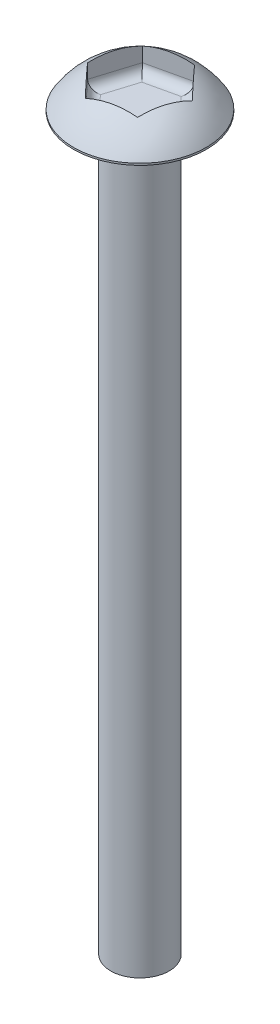
ISO-10303-21;
HEADER;
FILE_DESCRIPTION(('STEP AP214'),'2;1');
FILE_NAME('part.step','',(''),(''),'','','');
FILE_SCHEMA(('AUTOMOTIVE_DESIGN { 1 0 10303 214 1 1 1 1 }'));
ENDSEC;
DATA;
#1=APPLICATION_CONTEXT('core data for automotive mechanical design processes');
#2=APPLICATION_PROTOCOL_DEFINITION('international standard','automotive_design',2000,#1);
#3=PRODUCT_CONTEXT('',#1,'mechanical');
#4=PRODUCT('Part','Part','',(#3));
#5=PRODUCT_RELATED_PRODUCT_CATEGORY('part','',(#4));
#6=PRODUCT_DEFINITION_FORMATION('','',#4);
#7=PRODUCT_DEFINITION_CONTEXT('part definition',#1,'design');
#8=PRODUCT_DEFINITION('design','',#6,#7);
#9=PRODUCT_DEFINITION_SHAPE('','',#8);
#10=(LENGTH_UNIT() NAMED_UNIT(*) SI_UNIT(.MILLI.,.METRE.));
#11=(NAMED_UNIT(*) PLANE_ANGLE_UNIT() SI_UNIT($,.RADIAN.));
#12=(NAMED_UNIT(*) SI_UNIT($,.STERADIAN.) SOLID_ANGLE_UNIT());
#13=UNCERTAINTY_MEASURE_WITH_UNIT(LENGTH_MEASURE(1.E-05),#10,'distance_accuracy_value','');
#14=(GEOMETRIC_REPRESENTATION_CONTEXT(3) GLOBAL_UNCERTAINTY_ASSIGNED_CONTEXT((#13)) GLOBAL_UNIT_ASSIGNED_CONTEXT((#10,
#11,#12)) REPRESENTATION_CONTEXT('',''));
#15=CARTESIAN_POINT('',(0.,0.,0.));
#16=DIRECTION('',(0.,0.,1.));
#17=DIRECTION('',(1.,0.,0.));
#18=AXIS2_PLACEMENT_3D('',#15,#16,#17);
#19=CARTESIAN_POINT('',(0.,94.6495645899507,0.));
#20=DIRECTION('',(0.,0.,1.));
#21=DIRECTION('',(1.,0.,0.));
#22=AXIS2_PLACEMENT_3D('',#19,#20,#21);
#23=SPHERICAL_SURFACE('',#22,10.6844354100493);
#24=CARTESIAN_POINT('',(0.,100.254,0.));
#25=DIRECTION('',(0.,1.,0.));
#26=DIRECTION('',(0.,0.,1.));
#27=AXIS2_PLACEMENT_3D('',#24,#25,#26);
#28=CIRCLE('',#27,9.09656329423925);
#29=CARTESIAN_POINT('',(0.,100.254,9.09656329423925));
#30=VERTEX_POINT('',#29);
#31=EDGE_CURVE('E207',#30,#30,#28,.T.);
#32=ORIENTED_EDGE('',*,*,#31,.T.);
#33=EDGE_LOOP('',(#32));
#34=FACE_BOUND('',#33,.T.);
#35=CARTESIAN_POINT('',(-3.80527173605453,94.6495645899507,3.5235150143176));
#36=DIRECTION('',(0.733749594397492,0.,-0.679419997292923));
#37=DIRECTION('',(-0.679419997292924,0.,-0.733749594397492));
#38=AXIS2_PLACEMENT_3D('',#35,#36,#37);
#39=CIRCLE('',#38,9.34140829801257);
#40=CARTESIAN_POINT('',(-1.77096939404458,103.498113923583,5.72048967546836));
#41=VERTEX_POINT('',#40);
#42=CARTESIAN_POINT('',(-5.83957407806449,103.498113923583,1.32654035316684));
#43=VERTEX_POINT('',#42);
#44=EDGE_CURVE('E129',#41,#43,#39,.F.);
#45=ORIENTED_EDGE('',*,*,#44,.T.);
#46=CARTESIAN_POINT('',(-4.9540893810422,94.6495645899507,-1.53370448456734));
#47=DIRECTION('',(0.955269774693572,0.,0.295735790118294));
#48=DIRECTION('',(0.295735790118294,0.,-0.955269774693572));
#49=AXIS2_PLACEMENT_3D('',#46,#47,#48);
#50=CIRCLE('',#49,9.34140829801257);
#51=CARTESIAN_POINT('',(-4.06860468401991,103.498113923583,-4.39394932230152));
#52=VERTEX_POINT('',#51);
#53=EDGE_CURVE('E124',#43,#52,#50,.F.);
#54=ORIENTED_EDGE('',*,*,#53,.T.);
#55=CARTESIAN_POINT('',(-1.14881764498766,94.6495645899507,-5.05721949888494));
#56=DIRECTION('',(0.22152018029608,0.,0.975155787411218));
#57=DIRECTION('',(0.975155787411218,0.,-0.22152018029608));
#58=AXIS2_PLACEMENT_3D('',#55,#56,#57);
#59=CIRCLE('',#58,9.34140829801257);
#60=CARTESIAN_POINT('',(1.77096939404458,103.498113923583,-5.72048967546836));
#61=VERTEX_POINT('',#60);
#62=EDGE_CURVE('E107',#52,#61,#59,.F.);
#63=ORIENTED_EDGE('',*,*,#62,.T.);
#64=CARTESIAN_POINT('',(3.80527173605454,94.6495645899507,-3.5235150143176));
#65=DIRECTION('',(-0.733749594397492,0.,0.679419997292924));
#66=DIRECTION('',(0.679419997292924,0.,0.733749594397492));
#67=AXIS2_PLACEMENT_3D('',#64,#65,#66);
#68=CIRCLE('',#67,9.34140829801257);
#69=CARTESIAN_POINT('',(5.83957407806449,103.498113923583,-1.32654035316684));
#70=VERTEX_POINT('',#69);
#71=EDGE_CURVE('E119',#61,#70,#68,.F.);
#72=ORIENTED_EDGE('',*,*,#71,.T.);
#73=CARTESIAN_POINT('',(4.9540893810422,94.6495645899507,1.53370448456734));
#74=DIRECTION('',(-0.955269774693572,0.,-0.295735790118294));
#75=DIRECTION('',(-0.295735790118294,0.,0.955269774693572));
#76=AXIS2_PLACEMENT_3D('',#73,#74,#75);
#77=CIRCLE('',#76,9.34140829801257);
#78=CARTESIAN_POINT('',(4.06860468401991,103.498113923583,4.39394932230153));
#79=VERTEX_POINT('',#78);
#80=EDGE_CURVE('E216',#70,#79,#77,.F.);
#81=ORIENTED_EDGE('',*,*,#80,.T.);
#82=CARTESIAN_POINT('',(1.14881764498766,94.6495645899507,5.05721949888494));
#83=DIRECTION('',(-0.22152018029608,0.,-0.975155787411218));
#84=DIRECTION('',(-0.975155787411218,0.,0.22152018029608));
#85=AXIS2_PLACEMENT_3D('',#82,#83,#84);
#86=CIRCLE('',#85,9.34140829801257);
#87=EDGE_CURVE('E134',#79,#41,#86,.F.);
#88=ORIENTED_EDGE('',*,*,#87,.T.);
#89=EDGE_LOOP('',(#45,#54,#63,#72,#81,#88));
#90=FACE_BOUND('',#89,.T.);
#91=ADVANCED_FACE('F33',(#34,#90),#23,.T.);
#92=CARTESIAN_POINT('',(0.,100.,0.));
#93=DIRECTION('',(0.,-1.,0.));
#94=DIRECTION('',(0.,0.,-1.));
#95=AXIS2_PLACEMENT_3D('',#92,#93,#94);
#96=CYLINDRICAL_SURFACE('',#95,4.);
#97=CARTESIAN_POINT('',(0.,100.,0.));
#98=DIRECTION('',(0.,1.,0.));
#99=DIRECTION('',(0.,0.,1.));
#100=AXIS2_PLACEMENT_3D('',#97,#98,#99);
#101=CIRCLE('',#100,4.);
#102=CARTESIAN_POINT('',(0.,100.,4.));
#103=VERTEX_POINT('',#102);
#104=EDGE_CURVE('E120',#103,#103,#101,.T.);
#105=ORIENTED_EDGE('',*,*,#104,.F.);
#106=EDGE_LOOP('',(#105));
#107=FACE_BOUND('',#106,.T.);
#108=CARTESIAN_POINT('',(0.,0.,0.));
#109=DIRECTION('',(0.,1.,0.));
#110=DIRECTION('',(0.,0.,1.));
#111=AXIS2_PLACEMENT_3D('',#108,#109,#110);
#112=CIRCLE('',#111,4.);
#113=CARTESIAN_POINT('',(0.,0.,4.));
#114=VERTEX_POINT('',#113);
#115=EDGE_CURVE('E210',#114,#114,#112,.T.);
#116=ORIENTED_EDGE('',*,*,#115,.T.);
#117=EDGE_LOOP('',(#116));
#118=FACE_BOUND('',#117,.T.);
#119=ADVANCED_FACE('F232',(#107,#118),#96,.T.);
#120=CARTESIAN_POINT('',(0.,0.,0.));
#121=DIRECTION('',(0.,1.,0.));
#122=DIRECTION('',(0.,0.,1.));
#123=AXIS2_PLACEMENT_3D('',#120,#121,#122);
#124=PLANE('',#123);
#125=ORIENTED_EDGE('',*,*,#115,.F.);
#126=EDGE_LOOP('',(#125));
#127=FACE_BOUND('',#126,.T.);
#128=ADVANCED_FACE('F238',(#127),#124,.F.);
#129=CARTESIAN_POINT('',(0.,100.,0.));
#130=DIRECTION('',(0.,1.,0.));
#131=DIRECTION('',(0.,0.,1.));
#132=AXIS2_PLACEMENT_3D('',#129,#130,#131);
#133=PLANE('',#132);
#134=CARTESIAN_POINT('',(0.,100.,0.));
#135=DIRECTION('',(0.,1.,0.));
#136=DIRECTION('',(0.,0.,1.));
#137=AXIS2_PLACEMENT_3D('',#134,#135,#136);
#138=CIRCLE('',#137,9.09656329423925);
#139=CARTESIAN_POINT('',(0.,100.,9.09656329423925));
#140=VERTEX_POINT('',#139);
#141=EDGE_CURVE('E204',#140,#140,#138,.T.);
#142=ORIENTED_EDGE('',*,*,#141,.F.);
#143=EDGE_LOOP('',(#142));
#144=FACE_BOUND('',#143,.T.);
#145=ORIENTED_EDGE('',*,*,#104,.T.);
#146=EDGE_LOOP('',(#145));
#147=FACE_BOUND('',#146,.T.);
#148=ADVANCED_FACE('F313',(#144,#147),#133,.F.);
#149=CARTESIAN_POINT('',(0.,100.254,0.));
#150=DIRECTION('',(0.,-1.,0.));
#151=DIRECTION('',(0.,0.,-1.));
#152=AXIS2_PLACEMENT_3D('',#149,#150,#151);
#153=CYLINDRICAL_SURFACE('',#152,9.09656329423925);
#154=ORIENTED_EDGE('',*,*,#31,.F.);
#155=EDGE_LOOP('',(#154));
#156=FACE_BOUND('',#155,.T.);
#157=ORIENTED_EDGE('',*,*,#141,.T.);
#158=EDGE_LOOP('',(#157));
#159=FACE_BOUND('',#158,.T.);
#160=ADVANCED_FACE('F299',(#156,#159),#153,.T.);
#161=CARTESIAN_POINT('',(-4.06860468401991,105.334,-4.39394932230152));
#162=DIRECTION('',(0.955269774693572,0.,0.295735790118294));
#163=DIRECTION('',(0.295735790118294,0.,-0.955269774693572));
#164=AXIS2_PLACEMENT_3D('',#161,#162,#163);
#165=PLANE('',#164);
#166=DIRECTION('',(0.,-1.,0.));
#167=VECTOR('',#166,1.);
#168=CARTESIAN_POINT('',(-5.83957407806449,105.334,1.32654035316684));
#169=LINE('',#168,#167);
#170=CARTESIAN_POINT('',(-5.83957407806449,101.524,1.32654035316684));
#171=VERTEX_POINT('',#170);
#172=EDGE_CURVE('E202',#43,#171,#169,.T.);
#173=ORIENTED_EDGE('',*,*,#172,.T.);
#174=DIRECTION('',(-0.295735790118294,0.,0.955269774693572));
#175=VECTOR('',#174,1.);
#176=CARTESIAN_POINT('',(-4.06860468401991,101.524,-4.39394932230152));
#177=LINE('',#176,#175);
#178=CARTESIAN_POINT('',(-4.06860468401991,101.524,-4.39394932230152));
#179=VERTEX_POINT('',#178);
#180=EDGE_CURVE('E11',#171,#179,#177,.F.);
#181=ORIENTED_EDGE('',*,*,#180,.T.);
#182=DIRECTION('',(0.,-1.,0.));
#183=VECTOR('',#182,1.);
#184=CARTESIAN_POINT('',(-4.06860468401991,105.334,-4.39394932230152));
#185=LINE('',#184,#183);
#186=EDGE_CURVE('E111',#52,#179,#185,.T.);
#187=ORIENTED_EDGE('',*,*,#186,.F.);
#188=ORIENTED_EDGE('',*,*,#53,.F.);
#189=EDGE_LOOP('',(#173,#181,#187,#188));
#190=FACE_BOUND('',#189,.T.);
#191=ADVANCED_FACE('F123',(#190),#165,.T.);
#192=CARTESIAN_POINT('',(-5.83957407806449,105.334,1.32654035316684));
#193=DIRECTION('',(0.733749594397492,0.,-0.679419997292923));
#194=DIRECTION('',(-0.679419997292924,0.,-0.733749594397492));
#195=AXIS2_PLACEMENT_3D('',#192,#193,#194);
#196=PLANE('',#195);
#197=DIRECTION('',(0.,-1.,0.));
#198=VECTOR('',#197,1.);
#199=CARTESIAN_POINT('',(-1.77096939404458,105.334,5.72048967546836));
#200=LINE('',#199,#198);
#201=CARTESIAN_POINT('',(-1.77096939404458,101.524,5.72048967546836));
#202=VERTEX_POINT('',#201);
#203=EDGE_CURVE('E200',#41,#202,#200,.T.);
#204=ORIENTED_EDGE('',*,*,#203,.T.);
#205=DIRECTION('',(0.679419997292924,0.,0.733749594397492));
#206=VECTOR('',#205,1.);
#207=CARTESIAN_POINT('',(-5.83957407806449,101.524,1.32654035316684));
#208=LINE('',#207,#206);
#209=EDGE_CURVE('E42',#202,#171,#208,.F.);
#210=ORIENTED_EDGE('',*,*,#209,.T.);
#211=ORIENTED_EDGE('',*,*,#172,.F.);
#212=ORIENTED_EDGE('',*,*,#44,.F.);
#213=EDGE_LOOP('',(#204,#210,#211,#212));
#214=FACE_BOUND('',#213,.T.);
#215=ADVANCED_FACE('F229',(#214),#196,.T.);
#216=CARTESIAN_POINT('',(-1.77096939404458,105.334,5.72048967546836));
#217=DIRECTION('',(-0.22152018029608,0.,-0.975155787411218));
#218=DIRECTION('',(-0.975155787411218,0.,0.22152018029608));
#219=AXIS2_PLACEMENT_3D('',#216,#217,#218);
#220=PLANE('',#219);
#221=DIRECTION('',(0.,-1.,0.));
#222=VECTOR('',#221,1.);
#223=CARTESIAN_POINT('',(4.06860468401991,105.334,4.39394932230153));
#224=LINE('',#223,#222);
#225=CARTESIAN_POINT('',(4.06860468401991,101.524,4.39394932230153));
#226=VERTEX_POINT('',#225);
#227=EDGE_CURVE('E196',#79,#226,#224,.T.);
#228=ORIENTED_EDGE('',*,*,#227,.T.);
#229=DIRECTION('',(0.975155787411218,0.,-0.22152018029608));
#230=VECTOR('',#229,1.);
#231=CARTESIAN_POINT('',(-1.77096939404458,101.524,5.72048967546836));
#232=LINE('',#231,#230);
#233=EDGE_CURVE('E57',#226,#202,#232,.F.);
#234=ORIENTED_EDGE('',*,*,#233,.T.);
#235=ORIENTED_EDGE('',*,*,#203,.F.);
#236=ORIENTED_EDGE('',*,*,#87,.F.);
#237=EDGE_LOOP('',(#228,#234,#235,#236));
#238=FACE_BOUND('',#237,.T.);
#239=ADVANCED_FACE('F219',(#238),#220,.T.);
#240=CARTESIAN_POINT('',(4.06860468401991,105.334,4.39394932230153));
#241=DIRECTION('',(-0.955269774693572,0.,-0.295735790118294));
#242=DIRECTION('',(-0.295735790118294,0.,0.955269774693572));
#243=AXIS2_PLACEMENT_3D('',#240,#241,#242);
#244=PLANE('',#243);
#245=DIRECTION('',(0.,-1.,0.));
#246=VECTOR('',#245,1.);
#247=CARTESIAN_POINT('',(5.83957407806449,105.334,-1.32654035316684));
#248=LINE('',#247,#246);
#249=CARTESIAN_POINT('',(5.83957407806449,101.524,-1.32654035316684));
#250=VERTEX_POINT('',#249);
#251=EDGE_CURVE('E194',#70,#250,#248,.T.);
#252=ORIENTED_EDGE('',*,*,#251,.T.);
#253=DIRECTION('',(0.295735790118294,0.,-0.955269774693572));
#254=VECTOR('',#253,1.);
#255=CARTESIAN_POINT('',(4.06860468401991,101.524,4.39394932230153));
#256=LINE('',#255,#254);
#257=EDGE_CURVE('E152',#250,#226,#256,.F.);
#258=ORIENTED_EDGE('',*,*,#257,.T.);
#259=ORIENTED_EDGE('',*,*,#227,.F.);
#260=ORIENTED_EDGE('',*,*,#80,.F.);
#261=EDGE_LOOP('',(#252,#258,#259,#260));
#262=FACE_BOUND('',#261,.T.);
#263=ADVANCED_FACE('F221',(#262),#244,.T.);
#264=CARTESIAN_POINT('',(5.83957407806449,105.334,-1.32654035316684));
#265=DIRECTION('',(-0.733749594397492,0.,0.679419997292924));
#266=DIRECTION('',(0.679419997292924,0.,0.733749594397492));
#267=AXIS2_PLACEMENT_3D('',#264,#265,#266);
#268=PLANE('',#267);
#269=DIRECTION('',(0.,-1.,0.));
#270=VECTOR('',#269,1.);
#271=CARTESIAN_POINT('',(1.77096939404458,105.334,-5.72048967546836));
#272=LINE('',#271,#270);
#273=CARTESIAN_POINT('',(1.77096939404458,101.524,-5.72048967546836));
#274=VERTEX_POINT('',#273);
#275=EDGE_CURVE('E114',#61,#274,#272,.T.);
#276=ORIENTED_EDGE('',*,*,#275,.T.);
#277=DIRECTION('',(-0.679419997292924,0.,-0.733749594397492));
#278=VECTOR('',#277,1.);
#279=CARTESIAN_POINT('',(5.83957407806449,101.524,-1.32654035316684));
#280=LINE('',#279,#278);
#281=EDGE_CURVE('E150',#274,#250,#280,.F.);
#282=ORIENTED_EDGE('',*,*,#281,.T.);
#283=ORIENTED_EDGE('',*,*,#251,.F.);
#284=ORIENTED_EDGE('',*,*,#71,.F.);
#285=EDGE_LOOP('',(#276,#282,#283,#284));
#286=FACE_BOUND('',#285,.T.);
#287=ADVANCED_FACE('F191',(#286),#268,.T.);
#288=CARTESIAN_POINT('',(1.77096939404458,105.334,-5.72048967546836));
#289=DIRECTION('',(0.22152018029608,0.,0.975155787411218));
#290=DIRECTION('',(0.975155787411218,0.,-0.22152018029608));
#291=AXIS2_PLACEMENT_3D('',#288,#289,#290);
#292=PLANE('',#291);
#293=ORIENTED_EDGE('',*,*,#186,.T.);
#294=DIRECTION('',(-0.975155787411218,0.,0.22152018029608));
#295=VECTOR('',#294,1.);
#296=CARTESIAN_POINT('',(1.77096939404458,101.524,-5.72048967546836));
#297=LINE('',#296,#295);
#298=EDGE_CURVE('E148',#179,#274,#297,.F.);
#299=ORIENTED_EDGE('',*,*,#298,.T.);
#300=ORIENTED_EDGE('',*,*,#275,.F.);
#301=ORIENTED_EDGE('',*,*,#62,.F.);
#302=EDGE_LOOP('',(#293,#299,#300,#301));
#303=FACE_BOUND('',#302,.T.);
#304=ADVANCED_FACE('F109',(#303),#292,.T.);
#305=CARTESIAN_POINT('',(0.,100.254,0.));
#306=DIRECTION('',(0.,1.,0.));
#307=DIRECTION('',(0.,0.,1.));
#308=AXIS2_PLACEMENT_3D('',#305,#306,#307);
#309=PLANE('',#308);
#310=DIRECTION('',(-0.679419997292924,0.,-0.733749594397492));
#311=VECTOR('',#310,1.);
#312=CARTESIAN_POINT('',(0.839107409159768,100.254,-4.85762627890635));
#313=LINE('',#312,#311);
#314=CARTESIAN_POINT('',(4.40953767890072,100.254,-1.00168772442565));
#315=VERTEX_POINT('',#314);
#316=CARTESIAN_POINT('',(1.33728182343872,100.254,-4.31961551108552));
#317=VERTEX_POINT('',#316);
#318=EDGE_CURVE('E143',#315,#317,#313,.T.);
#319=ORIENTED_EDGE('',*,*,#318,.T.);
#320=DIRECTION('',(-0.975155787411218,0.,0.22152018029608));
#321=VECTOR('',#320,1.);
#322=CARTESIAN_POINT('',(-3.78727405504388,100.254,-3.15550147228928));
#323=LINE('',#322,#321);
#324=CARTESIAN_POINT('',(-3.072255855462,100.254,-3.31792778665987));
#325=VERTEX_POINT('',#324);
#326=EDGE_CURVE('E145',#317,#325,#323,.T.);
#327=ORIENTED_EDGE('',*,*,#326,.T.);
#328=DIRECTION('',(-0.295735790118294,0.,0.955269774693572));
#329=VECTOR('',#328,1.);
#330=CARTESIAN_POINT('',(-4.62638146420365,100.254,1.70212480661707));
#331=LINE('',#330,#329);
#332=CARTESIAN_POINT('',(-4.40953767890072,100.254,1.00168772442565));
#333=VERTEX_POINT('',#332);
#334=EDGE_CURVE('E130',#325,#333,#331,.T.);
#335=ORIENTED_EDGE('',*,*,#334,.T.);
#336=DIRECTION('',(0.679419997292924,0.,0.733749594397492));
#337=VECTOR('',#336,1.);
#338=CARTESIAN_POINT('',(-0.839107409159763,100.254,4.85762627890635));
#339=LINE('',#338,#337);
#340=CARTESIAN_POINT('',(-1.33728182343872,100.254,4.31961551108552));
#341=VERTEX_POINT('',#340);
#342=EDGE_CURVE('E132',#333,#341,#339,.T.);
#343=ORIENTED_EDGE('',*,*,#342,.T.);
#344=DIRECTION('',(0.975155787411218,0.,-0.22152018029608));
#345=VECTOR('',#344,1.);
#346=CARTESIAN_POINT('',(3.78727405504388,100.254,3.15550147228928));
#347=LINE('',#346,#345);
#348=CARTESIAN_POINT('',(3.072255855462,100.254,3.31792778665987));
#349=VERTEX_POINT('',#348);
#350=EDGE_CURVE('E139',#341,#349,#347,.T.);
#351=ORIENTED_EDGE('',*,*,#350,.T.);
#352=DIRECTION('',(0.295735790118294,0.,-0.955269774693572));
#353=VECTOR('',#352,1.);
#354=CARTESIAN_POINT('',(4.62638146420365,100.254,-1.70212480661707));
#355=LINE('',#354,#353);
#356=EDGE_CURVE('E141',#349,#315,#355,.T.);
#357=ORIENTED_EDGE('',*,*,#356,.T.);
#358=EDGE_LOOP('',(#319,#327,#335,#343,#351,#357));
#359=FACE_BOUND('',#358,.T.);
#360=ADVANCED_FACE('F256',(#359),#309,.T.);
#361=CARTESIAN_POINT('',(0.86748701601164,101.524,3.8187716488727));
#362=DIRECTION('',(-0.975155787411218,0.,0.22152018029608));
#363=DIRECTION('',(0.22152018029608,0.,0.975155787411218));
#364=AXIS2_PLACEMENT_3D('',#361,#362,#363);
#365=CYLINDRICAL_SURFACE('',#364,1.27);
#366=CARTESIAN_POINT('',(-1.33728182343872,101.524,4.31961551108552));
#367=DIRECTION('',(-0.955269774693572,0.,-0.295735790118294));
#368=DIRECTION('',(-0.295735790118294,0.,0.955269774693572));
#369=AXIS2_PLACEMENT_3D('',#366,#367,#368);
#370=ELLIPSE('',#369,1.46646968374165,1.27);
#371=EDGE_CURVE('E165',#202,#341,#370,.F.);
#372=ORIENTED_EDGE('',*,*,#371,.F.);
#373=ORIENTED_EDGE('',*,*,#233,.F.);
#374=CARTESIAN_POINT('',(3.072255855462,101.524,3.31792778665987));
#375=DIRECTION('',(-0.733749594397492,0.,0.679419997292923));
#376=DIRECTION('',(0.679419997292923,0.,0.733749594397492));
#377=AXIS2_PLACEMENT_3D('',#374,#375,#376);
#378=ELLIPSE('',#377,1.46646968374165,1.27);
#379=EDGE_CURVE('E37',#349,#226,#378,.T.);
#380=ORIENTED_EDGE('',*,*,#379,.F.);
#381=ORIENTED_EDGE('',*,*,#350,.F.);
#382=EDGE_LOOP('',(#372,#373,#380,#381));
#383=FACE_BOUND('',#382,.T.);
#384=ADVANCED_FACE('F35',(#383),#365,.F.);
#385=CARTESIAN_POINT('',(3.74089676718136,101.524,1.15812003111711));
#386=DIRECTION('',(-0.295735790118294,0.,0.955269774693572));
#387=DIRECTION('',(0.955269774693572,0.,0.295735790118294));
#388=AXIS2_PLACEMENT_3D('',#385,#386,#387);
#389=CYLINDRICAL_SURFACE('',#388,1.27);
#390=ORIENTED_EDGE('',*,*,#379,.T.);
#391=ORIENTED_EDGE('',*,*,#257,.F.);
#392=CARTESIAN_POINT('',(4.40953767890072,101.524,-1.00168772442565));
#393=DIRECTION('',(0.22152018029608,0.,0.975155787411218));
#394=DIRECTION('',(0.975155787411218,0.,-0.22152018029608));
#395=AXIS2_PLACEMENT_3D('',#392,#393,#394);
#396=ELLIPSE('',#395,1.46646968374165,1.27);
#397=EDGE_CURVE('E163',#315,#250,#396,.T.);
#398=ORIENTED_EDGE('',*,*,#397,.F.);
#399=ORIENTED_EDGE('',*,*,#356,.F.);
#400=EDGE_LOOP('',(#390,#391,#398,#399));
#401=FACE_BOUND('',#400,.T.);
#402=ADVANCED_FACE('F175',(#401),#389,.F.);
#403=CARTESIAN_POINT('',(-2.87340975116972,101.524,2.66065161775558));
#404=DIRECTION('',(-0.679419997292924,0.,-0.733749594397492));
#405=DIRECTION('',(-0.733749594397492,0.,0.679419997292924));
#406=AXIS2_PLACEMENT_3D('',#403,#404,#405);
#407=CYLINDRICAL_SURFACE('',#406,1.27);
#408=ORIENTED_EDGE('',*,*,#371,.T.);
#409=ORIENTED_EDGE('',*,*,#342,.F.);
#410=CARTESIAN_POINT('',(-4.40953767890072,101.524,1.00168772442565));
#411=DIRECTION('',(-0.22152018029608,0.,-0.975155787411218));
#412=DIRECTION('',(-0.975155787411218,0.,0.221520180296081));
#413=AXIS2_PLACEMENT_3D('',#410,#411,#412);
#414=ELLIPSE('',#413,1.46646968374165,1.27);
#415=EDGE_CURVE('E160',#171,#333,#414,.F.);
#416=ORIENTED_EDGE('',*,*,#415,.F.);
#417=ORIENTED_EDGE('',*,*,#209,.F.);
#418=EDGE_LOOP('',(#408,#409,#416,#417));
#419=FACE_BOUND('',#418,.T.);
#420=ADVANCED_FACE('F180',(#419),#407,.F.);
#421=CARTESIAN_POINT('',(2.87340975116972,101.524,-2.66065161775559));
#422=DIRECTION('',(0.679419997292924,0.,0.733749594397492));
#423=DIRECTION('',(0.733749594397492,0.,-0.679419997292924));
#424=AXIS2_PLACEMENT_3D('',#421,#422,#423);
#425=CYLINDRICAL_SURFACE('',#424,1.27);
#426=ORIENTED_EDGE('',*,*,#397,.T.);
#427=ORIENTED_EDGE('',*,*,#281,.F.);
#428=CARTESIAN_POINT('',(1.33728182343872,101.524,-4.31961551108552));
#429=DIRECTION('',(0.955269774693572,0.,0.295735790118294));
#430=DIRECTION('',(0.295735790118294,0.,-0.955269774693572));
#431=AXIS2_PLACEMENT_3D('',#428,#429,#430);
#432=ELLIPSE('',#431,1.46646968374165,1.27);
#433=EDGE_CURVE('E158',#317,#274,#432,.T.);
#434=ORIENTED_EDGE('',*,*,#433,.F.);
#435=ORIENTED_EDGE('',*,*,#318,.F.);
#436=EDGE_LOOP('',(#426,#427,#434,#435));
#437=FACE_BOUND('',#436,.T.);
#438=ADVANCED_FACE('F247',(#437),#425,.F.);
#439=CARTESIAN_POINT('',(-3.74089676718136,101.524,-1.15812003111711));
#440=DIRECTION('',(0.295735790118294,0.,-0.955269774693572));
#441=DIRECTION('',(-0.955269774693572,0.,-0.295735790118294));
#442=AXIS2_PLACEMENT_3D('',#439,#440,#441);
#443=CYLINDRICAL_SURFACE('',#442,1.27);
#444=ORIENTED_EDGE('',*,*,#415,.T.);
#445=ORIENTED_EDGE('',*,*,#334,.F.);
#446=CARTESIAN_POINT('',(-3.072255855462,101.524,-3.31792778665987));
#447=DIRECTION('',(0.733749594397492,0.,-0.679419997292924));
#448=DIRECTION('',(0.679419997292923,0.,0.733749594397492));
#449=AXIS2_PLACEMENT_3D('',#446,#447,#448);
#450=ELLIPSE('',#449,1.46646968374165,1.27);
#451=EDGE_CURVE('E156',#179,#325,#450,.F.);
#452=ORIENTED_EDGE('',*,*,#451,.F.);
#453=ORIENTED_EDGE('',*,*,#180,.F.);
#454=EDGE_LOOP('',(#444,#445,#452,#453));
#455=FACE_BOUND('',#454,.T.);
#456=ADVANCED_FACE('F184',(#455),#443,.F.);
#457=CARTESIAN_POINT('',(-0.86748701601164,101.524,-3.81877164887269));
#458=DIRECTION('',(0.975155787411218,0.,-0.22152018029608));
#459=DIRECTION('',(-0.22152018029608,0.,-0.975155787411218));
#460=AXIS2_PLACEMENT_3D('',#457,#458,#459);
#461=CYLINDRICAL_SURFACE('',#460,1.27);
#462=ORIENTED_EDGE('',*,*,#433,.T.);
#463=ORIENTED_EDGE('',*,*,#298,.F.);
#464=ORIENTED_EDGE('',*,*,#451,.T.);
#465=ORIENTED_EDGE('',*,*,#326,.F.);
#466=EDGE_LOOP('',(#462,#463,#464,#465));
#467=FACE_BOUND('',#466,.T.);
#468=ADVANCED_FACE('F187',(#467),#461,.F.);
#469=CLOSED_SHELL('',(#91,#119,#128,#148,#160,#191,#215,#239,#263,#287,#304,#360,#384,#402,#420,
#438,#456,#468));
#470=MANIFOLD_SOLID_BREP('B2',#469);
#471=ADVANCED_BREP_SHAPE_REPRESENTATION('',(#18,#470),#14);
#472=SHAPE_DEFINITION_REPRESENTATION(#9,#471);
ENDSEC;
END-ISO-10303-21;
